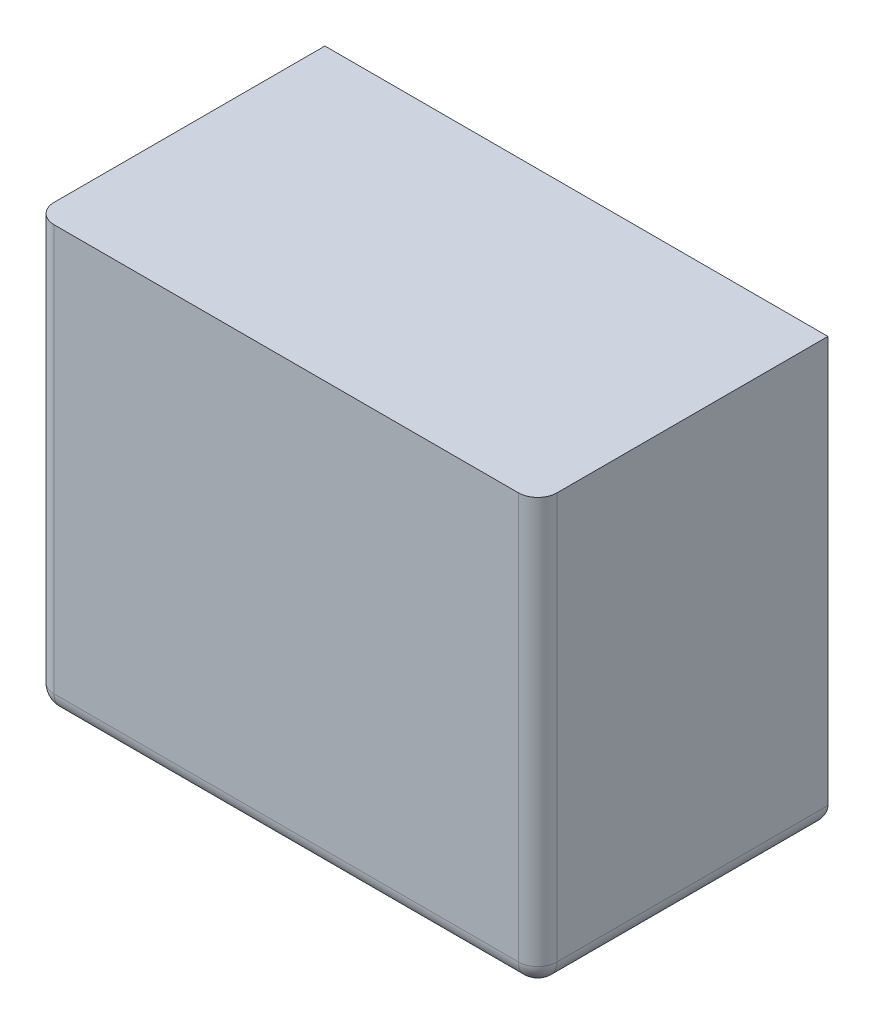
ISO-10303-21;
HEADER;
FILE_DESCRIPTION(('STEP AP214'),'2;1');
FILE_NAME('part.step','',(''),(''),'','','');
FILE_SCHEMA(('AUTOMOTIVE_DESIGN { 1 0 10303 214 1 1 1 1 }'));
ENDSEC;
DATA;
#1=APPLICATION_CONTEXT('core data for automotive mechanical design processes');
#2=APPLICATION_PROTOCOL_DEFINITION('international standard','automotive_design',2000,#1);
#3=PRODUCT_CONTEXT('',#1,'mechanical');
#4=PRODUCT('Part','Part','',(#3));
#5=PRODUCT_RELATED_PRODUCT_CATEGORY('part','',(#4));
#6=PRODUCT_DEFINITION_FORMATION('','',#4);
#7=PRODUCT_DEFINITION_CONTEXT('part definition',#1,'design');
#8=PRODUCT_DEFINITION('design','',#6,#7);
#9=PRODUCT_DEFINITION_SHAPE('','',#8);
#10=(LENGTH_UNIT() NAMED_UNIT(*) SI_UNIT(.MILLI.,.METRE.));
#11=(NAMED_UNIT(*) PLANE_ANGLE_UNIT() SI_UNIT($,.RADIAN.));
#12=(NAMED_UNIT(*) SI_UNIT($,.STERADIAN.) SOLID_ANGLE_UNIT());
#13=UNCERTAINTY_MEASURE_WITH_UNIT(LENGTH_MEASURE(1.E-05),#10,'distance_accuracy_value','');
#14=(GEOMETRIC_REPRESENTATION_CONTEXT(3) GLOBAL_UNCERTAINTY_ASSIGNED_CONTEXT((#13)) GLOBAL_UNIT_ASSIGNED_CONTEXT((#10,
#11,#12)) REPRESENTATION_CONTEXT('',''));
#15=CARTESIAN_POINT('',(0.,0.,0.));
#16=DIRECTION('',(0.,0.,1.));
#17=DIRECTION('',(1.,0.,0.));
#18=AXIS2_PLACEMENT_3D('',#15,#16,#17);
#19=CARTESIAN_POINT('',(260.,0.,150.));
#20=DIRECTION('',(0.,-1.,0.));
#21=DIRECTION('',(0.,0.,-1.));
#22=AXIS2_PLACEMENT_3D('',#19,#20,#21);
#23=PLANE('',#22);
#24=DIRECTION('',(-1.,0.,0.));
#25=VECTOR('',#24,1.);
#26=CARTESIAN_POINT('',(260.,0.,150.));
#27=LINE('',#26,#25);
#28=CARTESIAN_POINT('',(250.,0.,150.));
#29=VERTEX_POINT('',#28);
#30=CARTESIAN_POINT('',(10.,0.,150.));
#31=VERTEX_POINT('',#30);
#32=EDGE_CURVE('E134',#29,#31,#27,.T.);
#33=ORIENTED_EDGE('',*,*,#32,.F.);
#34=CARTESIAN_POINT('',(250.,0.,140.));
#35=DIRECTION('',(0.,-1.,0.));
#36=DIRECTION('',(0.,0.,-1.));
#37=AXIS2_PLACEMENT_3D('',#34,#35,#36);
#38=CIRCLE('',#37,10.);
#39=CARTESIAN_POINT('',(260.,0.,140.));
#40=VERTEX_POINT('',#39);
#41=EDGE_CURVE('E166',#29,#40,#38,.F.);
#42=ORIENTED_EDGE('',*,*,#41,.T.);
#43=DIRECTION('',(0.,0.,-1.));
#44=VECTOR('',#43,1.);
#45=CARTESIAN_POINT('',(260.,0.,150.));
#46=LINE('',#45,#44);
#47=CARTESIAN_POINT('',(260.,0.,0.));
#48=VERTEX_POINT('',#47);
#49=EDGE_CURVE('E113',#40,#48,#46,.T.);
#50=ORIENTED_EDGE('',*,*,#49,.T.);
#51=DIRECTION('',(-1.,0.,0.));
#52=VECTOR('',#51,1.);
#53=CARTESIAN_POINT('',(260.,0.,0.));
#54=LINE('',#53,#52);
#55=CARTESIAN_POINT('',(0.,0.,0.));
#56=VERTEX_POINT('',#55);
#57=EDGE_CURVE('E120',#48,#56,#54,.T.);
#58=ORIENTED_EDGE('',*,*,#57,.T.);
#59=DIRECTION('',(0.,0.,-1.));
#60=VECTOR('',#59,1.);
#61=CARTESIAN_POINT('',(0.,0.,150.));
#62=LINE('',#61,#60);
#63=CARTESIAN_POINT('',(0.,0.,140.));
#64=VERTEX_POINT('',#63);
#65=EDGE_CURVE('E104',#64,#56,#62,.T.);
#66=ORIENTED_EDGE('',*,*,#65,.F.);
#67=CARTESIAN_POINT('',(10.,0.,140.));
#68=DIRECTION('',(0.,-1.,0.));
#69=DIRECTION('',(0.,0.,-1.));
#70=AXIS2_PLACEMENT_3D('',#67,#68,#69);
#71=CIRCLE('',#70,10.);
#72=EDGE_CURVE('E163',#64,#31,#71,.F.);
#73=ORIENTED_EDGE('',*,*,#72,.T.);
#74=EDGE_LOOP('',(#33,#42,#50,#58,#66,#73));
#75=FACE_BOUND('',#74,.T.);
#76=ADVANCED_FACE('F38',(#75),#23,.F.);
#77=CARTESIAN_POINT('',(0.,0.,150.));
#78=DIRECTION('',(1.,0.,0.));
#79=DIRECTION('',(0.,1.,0.));
#80=AXIS2_PLACEMENT_3D('',#77,#78,#79);
#81=PLANE('',#80);
#82=DIRECTION('',(0.,-1.,0.));
#83=VECTOR('',#82,1.);
#84=CARTESIAN_POINT('',(0.,0.,0.));
#85=LINE('',#84,#83);
#86=CARTESIAN_POINT('',(0.,-210.,0.));
#87=VERTEX_POINT('',#86);
#88=EDGE_CURVE('E107',#56,#87,#85,.T.);
#89=ORIENTED_EDGE('',*,*,#88,.T.);
#90=DIRECTION('',(0.,0.,-1.));
#91=VECTOR('',#90,1.);
#92=CARTESIAN_POINT('',(0.,-210.,150.));
#93=LINE('',#92,#91);
#94=CARTESIAN_POINT('',(0.,-210.,140.));
#95=VERTEX_POINT('',#94);
#96=EDGE_CURVE('E11',#87,#95,#93,.F.);
#97=ORIENTED_EDGE('',*,*,#96,.T.);
#98=DIRECTION('',(0.,-1.,0.));
#99=VECTOR('',#98,1.);
#100=CARTESIAN_POINT('',(0.,0.,140.));
#101=LINE('',#100,#99);
#102=EDGE_CURVE('E48',#95,#64,#101,.F.);
#103=ORIENTED_EDGE('',*,*,#102,.T.);
#104=ORIENTED_EDGE('',*,*,#65,.T.);
#105=EDGE_LOOP('',(#89,#97,#103,#104));
#106=FACE_BOUND('',#105,.T.);
#107=ADVANCED_FACE('F106',(#106),#81,.F.);
#108=CARTESIAN_POINT('',(0.,-220.,150.));
#109=DIRECTION('',(0.,1.,0.));
#110=DIRECTION('',(0.,0.,1.));
#111=AXIS2_PLACEMENT_3D('',#108,#109,#110);
#112=PLANE('',#111);
#113=DIRECTION('',(0.,0.,-1.));
#114=VECTOR('',#113,1.);
#115=CARTESIAN_POINT('',(10.0000000000001,-220.,150.));
#116=LINE('',#115,#114);
#117=CARTESIAN_POINT('',(10.0000000000001,-220.,140.));
#118=VERTEX_POINT('',#117);
#119=CARTESIAN_POINT('',(10.0000000000001,-220.,10.));
#120=VERTEX_POINT('',#119);
#121=EDGE_CURVE('E112',#118,#120,#116,.T.);
#122=ORIENTED_EDGE('',*,*,#121,.T.);
#123=DIRECTION('',(1.,0.,0.));
#124=VECTOR('',#123,1.);
#125=CARTESIAN_POINT('',(0.,-220.,10.));
#126=LINE('',#125,#124);
#127=CARTESIAN_POINT('',(250.,-220.,10.));
#128=VERTEX_POINT('',#127);
#129=EDGE_CURVE('E148',#120,#128,#126,.T.);
#130=ORIENTED_EDGE('',*,*,#129,.T.);
#131=DIRECTION('',(0.,0.,-1.));
#132=VECTOR('',#131,1.);
#133=CARTESIAN_POINT('',(250.,-220.,150.));
#134=LINE('',#133,#132);
#135=CARTESIAN_POINT('',(250.,-220.,140.));
#136=VERTEX_POINT('',#135);
#137=EDGE_CURVE('E145',#128,#136,#134,.F.);
#138=ORIENTED_EDGE('',*,*,#137,.T.);
#139=DIRECTION('',(1.,0.,0.));
#140=VECTOR('',#139,1.);
#141=CARTESIAN_POINT('',(0.,-220.,140.));
#142=LINE('',#141,#140);
#143=EDGE_CURVE('E142',#136,#118,#142,.F.);
#144=ORIENTED_EDGE('',*,*,#143,.T.);
#145=EDGE_LOOP('',(#122,#130,#138,#144));
#146=FACE_BOUND('',#145,.T.);
#147=ADVANCED_FACE('F232',(#146),#112,.F.);
#148=CARTESIAN_POINT('',(260.,-220.,150.));
#149=DIRECTION('',(-1.,0.,0.));
#150=DIRECTION('',(0.,0.,1.));
#151=AXIS2_PLACEMENT_3D('',#148,#149,#150);
#152=PLANE('',#151);
#153=ORIENTED_EDGE('',*,*,#49,.F.);
#154=DIRECTION('',(0.,1.,0.));
#155=VECTOR('',#154,1.);
#156=CARTESIAN_POINT('',(260.,-220.,140.));
#157=LINE('',#156,#155);
#158=CARTESIAN_POINT('',(260.,-210.,140.));
#159=VERTEX_POINT('',#158);
#160=EDGE_CURVE('E62',#40,#159,#157,.F.);
#161=ORIENTED_EDGE('',*,*,#160,.T.);
#162=DIRECTION('',(0.,0.,-1.));
#163=VECTOR('',#162,1.);
#164=CARTESIAN_POINT('',(260.,-210.,150.));
#165=LINE('',#164,#163);
#166=CARTESIAN_POINT('',(260.,-210.,0.));
#167=VERTEX_POINT('',#166);
#168=EDGE_CURVE('E169',#159,#167,#165,.T.);
#169=ORIENTED_EDGE('',*,*,#168,.T.);
#170=DIRECTION('',(0.,1.,0.));
#171=VECTOR('',#170,1.);
#172=CARTESIAN_POINT('',(260.,-220.,0.));
#173=LINE('',#172,#171);
#174=EDGE_CURVE('E124',#167,#48,#173,.T.);
#175=ORIENTED_EDGE('',*,*,#174,.T.);
#176=EDGE_LOOP('',(#153,#161,#169,#175));
#177=FACE_BOUND('',#176,.T.);
#178=ADVANCED_FACE('F221',(#177),#152,.F.);
#179=CARTESIAN_POINT('',(0.,0.,150.));
#180=DIRECTION('',(0.,0.,1.));
#181=DIRECTION('',(1.,0.,0.));
#182=AXIS2_PLACEMENT_3D('',#179,#180,#181);
#183=PLANE('',#182);
#184=DIRECTION('',(1.,0.,0.));
#185=VECTOR('',#184,1.);
#186=CARTESIAN_POINT('',(260.,-210.,150.));
#187=LINE('',#186,#185);
#188=CARTESIAN_POINT('',(10.0000000000001,-210.,150.));
#189=VERTEX_POINT('',#188);
#190=CARTESIAN_POINT('',(250.,-210.,150.));
#191=VERTEX_POINT('',#190);
#192=EDGE_CURVE('E157',#189,#191,#187,.T.);
#193=ORIENTED_EDGE('',*,*,#192,.T.);
#194=DIRECTION('',(0.,1.,0.));
#195=VECTOR('',#194,1.);
#196=CARTESIAN_POINT('',(250.,0.,150.));
#197=LINE('',#196,#195);
#198=EDGE_CURVE('E160',#191,#29,#197,.T.);
#199=ORIENTED_EDGE('',*,*,#198,.T.);
#200=ORIENTED_EDGE('',*,*,#32,.T.);
#201=DIRECTION('',(0.,-1.,0.));
#202=VECTOR('',#201,1.);
#203=CARTESIAN_POINT('',(10.0000000000001,-220.,150.));
#204=LINE('',#203,#202);
#205=EDGE_CURVE('E154',#31,#189,#204,.T.);
#206=ORIENTED_EDGE('',*,*,#205,.T.);
#207=EDGE_LOOP('',(#193,#199,#200,#206));
#208=FACE_BOUND('',#207,.T.);
#209=ADVANCED_FACE('F216',(#208),#183,.T.);
#210=CARTESIAN_POINT('',(0.,0.,0.));
#211=DIRECTION('',(0.,0.,1.));
#212=DIRECTION('',(1.,0.,0.));
#213=AXIS2_PLACEMENT_3D('',#210,#211,#212);
#214=PLANE('',#213);
#215=ORIENTED_EDGE('',*,*,#174,.F.);
#216=DIRECTION('',(1.,0.,0.));
#217=VECTOR('',#216,1.);
#218=CARTESIAN_POINT('',(0.,-210.,0.));
#219=LINE('',#218,#217);
#220=EDGE_CURVE('E122',#167,#87,#219,.F.);
#221=ORIENTED_EDGE('',*,*,#220,.T.);
#222=ORIENTED_EDGE('',*,*,#88,.F.);
#223=ORIENTED_EDGE('',*,*,#57,.F.);
#224=EDGE_LOOP('',(#215,#221,#222,#223));
#225=FACE_BOUND('',#224,.T.);
#226=ADVANCED_FACE('F119',(#225),#214,.F.);
#227=CARTESIAN_POINT('',(10.,0.,140.));
#228=DIRECTION('',(0.,1.,0.));
#229=DIRECTION('',(-1.,0.,0.));
#230=AXIS2_PLACEMENT_3D('',#227,#228,#229);
#231=CYLINDRICAL_SURFACE('',#230,10.);
#232=ORIENTED_EDGE('',*,*,#72,.F.);
#233=ORIENTED_EDGE('',*,*,#102,.F.);
#234=CARTESIAN_POINT('',(10.0000000000001,-210.,140.));
#235=DIRECTION('',(0.,-1.,0.));
#236=DIRECTION('',(0.,0.,-1.));
#237=AXIS2_PLACEMENT_3D('',#234,#235,#236);
#238=CIRCLE('',#237,10.);
#239=EDGE_CURVE('E42',#189,#95,#238,.T.);
#240=ORIENTED_EDGE('',*,*,#239,.F.);
#241=ORIENTED_EDGE('',*,*,#205,.F.);
#242=EDGE_LOOP('',(#232,#233,#240,#241));
#243=FACE_BOUND('',#242,.T.);
#244=ADVANCED_FACE('F40',(#243),#231,.T.);
#245=CARTESIAN_POINT('',(0.,-210.,140.));
#246=DIRECTION('',(-1.,0.,0.));
#247=DIRECTION('',(0.,0.,1.));
#248=AXIS2_PLACEMENT_3D('',#245,#246,#247);
#249=CYLINDRICAL_SURFACE('',#248,10.);
#250=CARTESIAN_POINT('',(250.,-210.,140.));
#251=DIRECTION('',(1.,0.,0.));
#252=DIRECTION('',(0.,0.,-1.));
#253=AXIS2_PLACEMENT_3D('',#250,#251,#252);
#254=CIRCLE('',#253,10.);
#255=EDGE_CURVE('E194',#191,#136,#254,.T.);
#256=ORIENTED_EDGE('',*,*,#255,.F.);
#257=ORIENTED_EDGE('',*,*,#192,.F.);
#258=CARTESIAN_POINT('',(10.0000000000001,-210.,140.));
#259=DIRECTION('',(-1.,0.,0.));
#260=DIRECTION('',(0.,0.,1.));
#261=AXIS2_PLACEMENT_3D('',#258,#259,#260);
#262=CIRCLE('',#261,10.);
#263=EDGE_CURVE('E132',#118,#189,#262,.T.);
#264=ORIENTED_EDGE('',*,*,#263,.F.);
#265=ORIENTED_EDGE('',*,*,#143,.F.);
#266=EDGE_LOOP('',(#256,#257,#264,#265));
#267=FACE_BOUND('',#266,.T.);
#268=ADVANCED_FACE('F209',(#267),#249,.T.);
#269=CARTESIAN_POINT('',(250.,0.,140.));
#270=DIRECTION('',(0.,-1.,0.));
#271=DIRECTION('',(0.,0.,-1.));
#272=AXIS2_PLACEMENT_3D('',#269,#270,#271);
#273=CYLINDRICAL_SURFACE('',#272,10.);
#274=ORIENTED_EDGE('',*,*,#41,.F.);
#275=ORIENTED_EDGE('',*,*,#198,.F.);
#276=CARTESIAN_POINT('',(250.,-210.,140.));
#277=DIRECTION('',(0.,-1.,0.));
#278=DIRECTION('',(0.,0.,-1.));
#279=AXIS2_PLACEMENT_3D('',#276,#277,#278);
#280=CIRCLE('',#279,10.);
#281=EDGE_CURVE('E190',#159,#191,#280,.T.);
#282=ORIENTED_EDGE('',*,*,#281,.F.);
#283=ORIENTED_EDGE('',*,*,#160,.F.);
#284=EDGE_LOOP('',(#274,#275,#282,#283));
#285=FACE_BOUND('',#284,.T.);
#286=ADVANCED_FACE('F219',(#285),#273,.T.);
#287=CARTESIAN_POINT('',(10.0000000000001,-210.,140.));
#288=DIRECTION('',(0.,0.,1.));
#289=DIRECTION('',(1.,0.,0.));
#290=AXIS2_PLACEMENT_3D('',#287,#288,#289);
#291=SPHERICAL_SURFACE('',#290,10.);
#292=ORIENTED_EDGE('',*,*,#263,.T.);
#293=ORIENTED_EDGE('',*,*,#239,.T.);
#294=CARTESIAN_POINT('',(10.0000000000001,-210.,140.));
#295=DIRECTION('',(0.,0.,1.));
#296=DIRECTION('',(1.,0.,0.));
#297=AXIS2_PLACEMENT_3D('',#294,#295,#296);
#298=CIRCLE('',#297,10.);
#299=EDGE_CURVE('E186',#118,#95,#298,.F.);
#300=ORIENTED_EDGE('',*,*,#299,.F.);
#301=EDGE_LOOP('',(#292,#293,#300));
#302=FACE_BOUND('',#301,.T.);
#303=ADVANCED_FACE('F202',(#302),#291,.T.);
#304=CARTESIAN_POINT('',(250.,-210.,140.));
#305=DIRECTION('',(0.,0.,1.));
#306=DIRECTION('',(1.,0.,0.));
#307=AXIS2_PLACEMENT_3D('',#304,#305,#306);
#308=SPHERICAL_SURFACE('',#307,10.);
#309=ORIENTED_EDGE('',*,*,#281,.T.);
#310=ORIENTED_EDGE('',*,*,#255,.T.);
#311=CARTESIAN_POINT('',(250.,-210.,140.));
#312=DIRECTION('',(0.,0.,1.));
#313=DIRECTION('',(1.,0.,0.));
#314=AXIS2_PLACEMENT_3D('',#311,#312,#313);
#315=CIRCLE('',#314,10.);
#316=EDGE_CURVE('E182',#159,#136,#315,.F.);
#317=ORIENTED_EDGE('',*,*,#316,.F.);
#318=EDGE_LOOP('',(#309,#310,#317));
#319=FACE_BOUND('',#318,.T.);
#320=ADVANCED_FACE('F236',(#319),#308,.T.);
#321=CARTESIAN_POINT('',(10.0000000000001,-210.,150.));
#322=DIRECTION('',(0.,0.,-1.));
#323=DIRECTION('',(-1.,0.,0.));
#324=AXIS2_PLACEMENT_3D('',#321,#322,#323);
#325=CYLINDRICAL_SURFACE('',#324,10.);
#326=ORIENTED_EDGE('',*,*,#299,.T.);
#327=ORIENTED_EDGE('',*,*,#96,.F.);
#328=CARTESIAN_POINT('',(10.0000000000001,-210.,10.));
#329=DIRECTION('',(0.707106781186547,0.,-0.707106781186547));
#330=DIRECTION('',(-0.707106781186547,0.,-0.707106781186547));
#331=AXIS2_PLACEMENT_3D('',#328,#329,#330);
#332=ELLIPSE('',#331,14.1421356237309,10.);
#333=EDGE_CURVE('E179',#120,#87,#332,.T.);
#334=ORIENTED_EDGE('',*,*,#333,.F.);
#335=ORIENTED_EDGE('',*,*,#121,.F.);
#336=EDGE_LOOP('',(#326,#327,#334,#335));
#337=FACE_BOUND('',#336,.T.);
#338=ADVANCED_FACE('F234',(#337),#325,.T.);
#339=CARTESIAN_POINT('',(250.,-210.,150.));
#340=DIRECTION('',(0.,0.,-1.));
#341=DIRECTION('',(-1.,0.,0.));
#342=AXIS2_PLACEMENT_3D('',#339,#340,#341);
#343=CYLINDRICAL_SURFACE('',#342,10.);
#344=ORIENTED_EDGE('',*,*,#316,.T.);
#345=ORIENTED_EDGE('',*,*,#137,.F.);
#346=CARTESIAN_POINT('',(250.,-210.,10.));
#347=DIRECTION('',(-0.707106781186547,0.,-0.707106781186547));
#348=DIRECTION('',(0.707106781186547,0.,-0.707106781186547));
#349=AXIS2_PLACEMENT_3D('',#346,#347,#348);
#350=ELLIPSE('',#349,14.1421356237309,10.);
#351=EDGE_CURVE('E176',#167,#128,#350,.T.);
#352=ORIENTED_EDGE('',*,*,#351,.F.);
#353=ORIENTED_EDGE('',*,*,#168,.F.);
#354=EDGE_LOOP('',(#344,#345,#352,#353));
#355=FACE_BOUND('',#354,.T.);
#356=ADVANCED_FACE('F230',(#355),#343,.T.);
#357=CARTESIAN_POINT('',(0.,-210.,10.));
#358=DIRECTION('',(1.,0.,0.));
#359=DIRECTION('',(0.,0.,-1.));
#360=AXIS2_PLACEMENT_3D('',#357,#358,#359);
#361=CYLINDRICAL_SURFACE('',#360,10.);
#362=ORIENTED_EDGE('',*,*,#333,.T.);
#363=ORIENTED_EDGE('',*,*,#220,.F.);
#364=ORIENTED_EDGE('',*,*,#351,.T.);
#365=ORIENTED_EDGE('',*,*,#129,.F.);
#366=EDGE_LOOP('',(#362,#363,#364,#365));
#367=FACE_BOUND('',#366,.T.);
#368=ADVANCED_FACE('F225',(#367),#361,.T.);
#369=CLOSED_SHELL('',(#76,#107,#147,#178,#209,#226,#244,#268,#286,#303,#320,#338,#356,#368));
#370=MANIFOLD_SOLID_BREP('B2',#369);
#371=ADVANCED_BREP_SHAPE_REPRESENTATION('',(#18,#370),#14);
#372=SHAPE_DEFINITION_REPRESENTATION(#9,#371);
ENDSEC;
END-ISO-10303-21;
